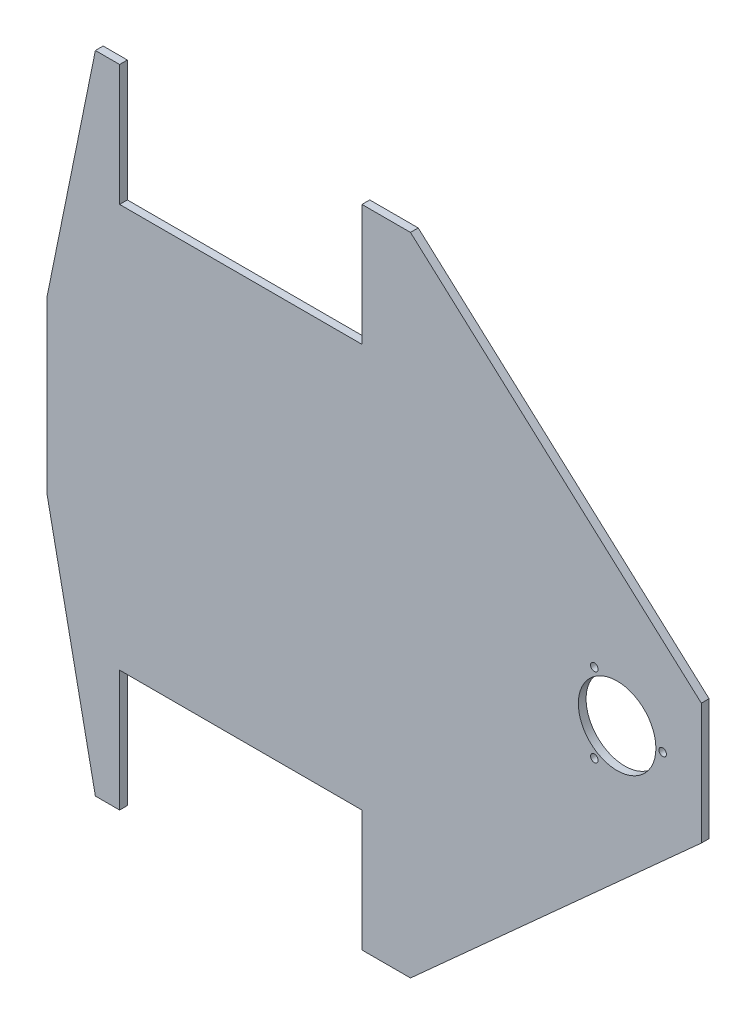
ISO-10303-21;
HEADER;
FILE_DESCRIPTION(('STEP AP214'),'2;1');
FILE_NAME('part.step','',(''),(''),'','','');
FILE_SCHEMA(('AUTOMOTIVE_DESIGN { 1 0 10303 214 1 1 1 1 }'));
ENDSEC;
DATA;
#1=APPLICATION_CONTEXT('core data for automotive mechanical design processes');
#2=APPLICATION_PROTOCOL_DEFINITION('international standard','automotive_design',2000,#1);
#3=PRODUCT_CONTEXT('',#1,'mechanical');
#4=PRODUCT('Part','Part','',(#3));
#5=PRODUCT_RELATED_PRODUCT_CATEGORY('part','',(#4));
#6=PRODUCT_DEFINITION_FORMATION('','',#4);
#7=PRODUCT_DEFINITION_CONTEXT('part definition',#1,'design');
#8=PRODUCT_DEFINITION('design','',#6,#7);
#9=PRODUCT_DEFINITION_SHAPE('','',#8);
#10=(LENGTH_UNIT() NAMED_UNIT(*) SI_UNIT(.MILLI.,.METRE.));
#11=(NAMED_UNIT(*) PLANE_ANGLE_UNIT() SI_UNIT($,.RADIAN.));
#12=(NAMED_UNIT(*) SI_UNIT($,.STERADIAN.) SOLID_ANGLE_UNIT());
#13=UNCERTAINTY_MEASURE_WITH_UNIT(LENGTH_MEASURE(1.E-05),#10,'distance_accuracy_value','');
#14=(GEOMETRIC_REPRESENTATION_CONTEXT(3) GLOBAL_UNCERTAINTY_ASSIGNED_CONTEXT((#13)) GLOBAL_UNIT_ASSIGNED_CONTEXT((#10,
#11,#12)) REPRESENTATION_CONTEXT('',''));
#15=CARTESIAN_POINT('',(0.,0.,0.));
#16=DIRECTION('',(0.,0.,1.));
#17=DIRECTION('',(1.,0.,0.));
#18=AXIS2_PLACEMENT_3D('',#15,#16,#17);
#19=CARTESIAN_POINT('',(0.,0.,0.));
#20=DIRECTION('',(0.,0.,1.));
#21=DIRECTION('',(1.,0.,0.));
#22=AXIS2_PLACEMENT_3D('',#19,#20,#21);
#23=PLANE('',#22);
#24=CARTESIAN_POINT('',(145.85,95.8088150912347,0.));
#25=DIRECTION('',(0.,0.,-1.));
#26=DIRECTION('',(-1.,0.,0.));
#27=AXIS2_PLACEMENT_3D('',#24,#25,#26);
#28=CIRCLE('',#27,1.55);
#29=CARTESIAN_POINT('',(144.3,95.8088150912347,0.));
#30=VERTEX_POINT('',#29);
#31=EDGE_CURVE('E301',#30,#30,#28,.T.);
#32=ORIENTED_EDGE('',*,*,#31,.F.);
#33=EDGE_LOOP('',(#32));
#34=FACE_BOUND('',#33,.T.);
#35=CARTESIAN_POINT('',(145.85,63.2462599089398,0.));
#36=DIRECTION('',(0.,0.,-1.));
#37=DIRECTION('',(-1.,0.,0.));
#38=AXIS2_PLACEMENT_3D('',#35,#36,#37);
#39=CIRCLE('',#38,1.55);
#40=CARTESIAN_POINT('',(144.3,63.2462599089398,0.));
#41=VERTEX_POINT('',#40);
#42=EDGE_CURVE('E303',#41,#41,#39,.T.);
#43=ORIENTED_EDGE('',*,*,#42,.F.);
#44=EDGE_LOOP('',(#43));
#45=FACE_BOUND('',#44,.T.);
#46=CARTESIAN_POINT('',(155.25,79.5275375000873,0.));
#47=DIRECTION('',(0.,0.,1.));
#48=DIRECTION('',(1.,0.,0.));
#49=AXIS2_PLACEMENT_3D('',#46,#47,#48);
#50=CIRCLE('',#49,16.);
#51=CARTESIAN_POINT('',(171.25,79.5275375000873,0.));
#52=VERTEX_POINT('',#51);
#53=EDGE_CURVE('E43',#52,#52,#50,.T.);
#54=ORIENTED_EDGE('',*,*,#53,.T.);
#55=EDGE_LOOP('',(#54));
#56=FACE_BOUND('',#55,.T.);
#57=DIRECTION('',(0.,1.,0.));
#58=VECTOR('',#57,1.);
#59=CARTESIAN_POINT('',(-80.,45.,0.));
#60=LINE('',#59,#58);
#61=CARTESIAN_POINT('',(-80.,45.,0.));
#62=VERTEX_POINT('',#61);
#63=CARTESIAN_POINT('',(-80.,115.,0.));
#64=VERTEX_POINT('',#63);
#65=EDGE_CURVE('E186',#62,#64,#60,.T.);
#66=ORIENTED_EDGE('',*,*,#65,.T.);
#67=DIRECTION('',(0.199568997239386,0.979883776445383,0.));
#68=VECTOR('',#67,1.);
#69=CARTESIAN_POINT('',(-80.,115.,0.));
#70=LINE('',#69,#68);
#71=CARTESIAN_POINT('',(-60.,213.2,0.));
#72=VERTEX_POINT('',#71);
#73=EDGE_CURVE('E189',#64,#72,#70,.T.);
#74=ORIENTED_EDGE('',*,*,#73,.T.);
#75=DIRECTION('',(-1.,0.,0.));
#76=VECTOR('',#75,1.);
#77=CARTESIAN_POINT('',(-50.,213.2,0.));
#78=LINE('',#77,#76);
#79=CARTESIAN_POINT('',(-50.,213.2,0.));
#80=VERTEX_POINT('',#79);
#81=EDGE_CURVE('E192',#80,#72,#78,.T.);
#82=ORIENTED_EDGE('',*,*,#81,.F.);
#83=DIRECTION('',(0.,1.,0.));
#84=VECTOR('',#83,1.);
#85=CARTESIAN_POINT('',(-50.,163.2,0.));
#86=LINE('',#85,#84);
#87=CARTESIAN_POINT('',(-50.,163.2,0.));
#88=VERTEX_POINT('',#87);
#89=EDGE_CURVE('E195',#88,#80,#86,.T.);
#90=ORIENTED_EDGE('',*,*,#89,.F.);
#91=DIRECTION('',(-1.,0.,0.));
#92=VECTOR('',#91,1.);
#93=CARTESIAN_POINT('',(50.,163.2,0.));
#94=LINE('',#93,#92);
#95=CARTESIAN_POINT('',(50.,163.2,0.));
#96=VERTEX_POINT('',#95);
#97=EDGE_CURVE('E197',#96,#88,#94,.T.);
#98=ORIENTED_EDGE('',*,*,#97,.F.);
#99=DIRECTION('',(0.,1.,0.));
#100=VECTOR('',#99,1.);
#101=CARTESIAN_POINT('',(50.,163.2,0.));
#102=LINE('',#101,#100);
#103=CARTESIAN_POINT('',(50.,213.2,0.));
#104=VERTEX_POINT('',#103);
#105=EDGE_CURVE('E199',#96,#104,#102,.T.);
#106=ORIENTED_EDGE('',*,*,#105,.T.);
#107=DIRECTION('',(1.,0.,0.));
#108=VECTOR('',#107,1.);
#109=CARTESIAN_POINT('',(50.,213.2,0.));
#110=LINE('',#109,#108);
#111=CARTESIAN_POINT('',(70.,213.2,0.));
#112=VERTEX_POINT('',#111);
#113=EDGE_CURVE('E202',#104,#112,#110,.T.);
#114=ORIENTED_EDGE('',*,*,#113,.T.);
#115=DIRECTION('',(0.742678352355033,-0.669648314373458,0.));
#116=VECTOR('',#115,1.);
#117=CARTESIAN_POINT('',(70.,213.2,0.));
#118=LINE('',#117,#116);
#119=CARTESIAN_POINT('',(190.000000000002,104.999999999998,0.));
#120=VERTEX_POINT('',#119);
#121=EDGE_CURVE('E205',#112,#120,#118,.T.);
#122=ORIENTED_EDGE('',*,*,#121,.T.);
#123=DIRECTION('',(0.,-1.,0.));
#124=VECTOR('',#123,1.);
#125=CARTESIAN_POINT('',(190.000000000002,104.999999999998,0.));
#126=LINE('',#125,#124);
#127=CARTESIAN_POINT('',(190.000000000001,54.9999999999979,0.));
#128=VERTEX_POINT('',#127);
#129=EDGE_CURVE('E208',#120,#128,#126,.T.);
#130=ORIENTED_EDGE('',*,*,#129,.T.);
#131=DIRECTION('',(-0.742678352355045,-0.669648314373445,0.));
#132=VECTOR('',#131,1.);
#133=CARTESIAN_POINT('',(190.000000000001,54.9999999999979,0.));
#134=LINE('',#133,#132);
#135=CARTESIAN_POINT('',(70.,-53.2,0.));
#136=VERTEX_POINT('',#135);
#137=EDGE_CURVE('E211',#128,#136,#134,.T.);
#138=ORIENTED_EDGE('',*,*,#137,.T.);
#139=DIRECTION('',(1.,0.,0.));
#140=VECTOR('',#139,1.);
#141=CARTESIAN_POINT('',(50.,-53.2,0.));
#142=LINE('',#141,#140);
#143=CARTESIAN_POINT('',(50.,-53.2,0.));
#144=VERTEX_POINT('',#143);
#145=EDGE_CURVE('E214',#144,#136,#142,.T.);
#146=ORIENTED_EDGE('',*,*,#145,.F.);
#147=DIRECTION('',(0.,-1.,0.));
#148=VECTOR('',#147,1.);
#149=CARTESIAN_POINT('',(50.,-3.2,0.));
#150=LINE('',#149,#148);
#151=CARTESIAN_POINT('',(50.,-3.2,0.));
#152=VERTEX_POINT('',#151);
#153=EDGE_CURVE('E217',#152,#144,#150,.T.);
#154=ORIENTED_EDGE('',*,*,#153,.F.);
#155=DIRECTION('',(-1.,0.,0.));
#156=VECTOR('',#155,1.);
#157=CARTESIAN_POINT('',(50.,-3.2,0.));
#158=LINE('',#157,#156);
#159=CARTESIAN_POINT('',(-50.,-3.2,0.));
#160=VERTEX_POINT('',#159);
#161=EDGE_CURVE('E219',#152,#160,#158,.T.);
#162=ORIENTED_EDGE('',*,*,#161,.T.);
#163=DIRECTION('',(0.,-1.,0.));
#164=VECTOR('',#163,1.);
#165=CARTESIAN_POINT('',(-50.,-3.2,0.));
#166=LINE('',#165,#164);
#167=CARTESIAN_POINT('',(-50.,-53.2,0.));
#168=VERTEX_POINT('',#167);
#169=EDGE_CURVE('E222',#160,#168,#166,.T.);
#170=ORIENTED_EDGE('',*,*,#169,.T.);
#171=DIRECTION('',(-1.,0.,0.));
#172=VECTOR('',#171,1.);
#173=CARTESIAN_POINT('',(-50.,-53.2,0.));
#174=LINE('',#173,#172);
#175=CARTESIAN_POINT('',(-60.,-53.2,0.));
#176=VERTEX_POINT('',#175);
#177=EDGE_CURVE('E163',#168,#176,#174,.T.);
#178=ORIENTED_EDGE('',*,*,#177,.T.);
#179=DIRECTION('',(-0.199568997239386,0.979883776445383,0.));
#180=VECTOR('',#179,1.);
#181=CARTESIAN_POINT('',(-60.,-53.2,0.));
#182=LINE('',#181,#180);
#183=EDGE_CURVE('E225',#176,#62,#182,.T.);
#184=ORIENTED_EDGE('',*,*,#183,.T.);
#185=EDGE_LOOP('',(#66,#74,#82,#90,#98,#106,#114,#122,#130,#138,#146,#154,#162,#170,#178,#184));
#186=FACE_BOUND('',#185,.T.);
#187=CARTESIAN_POINT('',(174.05,79.5275375000871,0.));
#188=DIRECTION('',(0.,0.,-1.));
#189=DIRECTION('',(-1.,0.,0.));
#190=AXIS2_PLACEMENT_3D('',#187,#188,#189);
#191=CIRCLE('',#190,1.55);
#192=CARTESIAN_POINT('',(172.5,79.5275375000871,0.));
#193=VERTEX_POINT('',#192);
#194=EDGE_CURVE('E311',#193,#193,#191,.T.);
#195=ORIENTED_EDGE('',*,*,#194,.F.);
#196=EDGE_LOOP('',(#195));
#197=FACE_BOUND('',#196,.T.);
#198=ADVANCED_FACE('F39',(#34,#45,#56,#186,#197),#23,.F.);
#199=CARTESIAN_POINT('',(-80.,45.,3.2));
#200=DIRECTION('',(-1.,0.,0.));
#201=DIRECTION('',(0.,0.,1.));
#202=AXIS2_PLACEMENT_3D('',#199,#200,#201);
#203=PLANE('',#202);
#204=ORIENTED_EDGE('',*,*,#65,.F.);
#205=DIRECTION('',(0.,0.,-1.));
#206=VECTOR('',#205,1.);
#207=CARTESIAN_POINT('',(-80.,45.,3.2));
#208=LINE('',#207,#206);
#209=CARTESIAN_POINT('',(-80.,45.,3.2));
#210=VERTEX_POINT('',#209);
#211=EDGE_CURVE('E11',#210,#62,#208,.T.);
#212=ORIENTED_EDGE('',*,*,#211,.F.);
#213=DIRECTION('',(0.,1.,0.));
#214=VECTOR('',#213,1.);
#215=CARTESIAN_POINT('',(-80.,45.,3.2));
#216=LINE('',#215,#214);
#217=CARTESIAN_POINT('',(-80.,115.,3.2));
#218=VERTEX_POINT('',#217);
#219=EDGE_CURVE('E227',#210,#218,#216,.T.);
#220=ORIENTED_EDGE('',*,*,#219,.T.);
#221=DIRECTION('',(0.,0.,-1.));
#222=VECTOR('',#221,1.);
#223=CARTESIAN_POINT('',(-80.,115.,3.2));
#224=LINE('',#223,#222);
#225=EDGE_CURVE('E120',#218,#64,#224,.T.);
#226=ORIENTED_EDGE('',*,*,#225,.T.);
#227=EDGE_LOOP('',(#204,#212,#220,#226));
#228=FACE_BOUND('',#227,.T.);
#229=ADVANCED_FACE('F41',(#228),#203,.T.);
#230=CARTESIAN_POINT('',(-60.,-53.2,3.2));
#231=DIRECTION('',(-0.979883776445383,-0.199568997239386,0.));
#232=DIRECTION('',(0.199568997239386,-0.979883776445383,0.));
#233=AXIS2_PLACEMENT_3D('',#230,#231,#232);
#234=PLANE('',#233);
#235=ORIENTED_EDGE('',*,*,#183,.F.);
#236=DIRECTION('',(0.,0.,-1.));
#237=VECTOR('',#236,1.);
#238=CARTESIAN_POINT('',(-60.,-53.2,3.2));
#239=LINE('',#238,#237);
#240=CARTESIAN_POINT('',(-60.,-53.2,3.2));
#241=VERTEX_POINT('',#240);
#242=EDGE_CURVE('E49',#241,#176,#239,.T.);
#243=ORIENTED_EDGE('',*,*,#242,.F.);
#244=DIRECTION('',(-0.199568997239386,0.979883776445383,0.));
#245=VECTOR('',#244,1.);
#246=CARTESIAN_POINT('',(-60.,-53.2,3.2));
#247=LINE('',#246,#245);
#248=EDGE_CURVE('E176',#241,#210,#247,.T.);
#249=ORIENTED_EDGE('',*,*,#248,.T.);
#250=ORIENTED_EDGE('',*,*,#211,.T.);
#251=EDGE_LOOP('',(#235,#243,#249,#250));
#252=FACE_BOUND('',#251,.T.);
#253=ADVANCED_FACE('F260',(#252),#234,.T.);
#254=CARTESIAN_POINT('',(-50.,-53.2,3.2));
#255=DIRECTION('',(0.,-1.,0.));
#256=DIRECTION('',(0.,0.,-1.));
#257=AXIS2_PLACEMENT_3D('',#254,#255,#256);
#258=PLANE('',#257);
#259=ORIENTED_EDGE('',*,*,#177,.F.);
#260=DIRECTION('',(0.,0.,-1.));
#261=VECTOR('',#260,1.);
#262=CARTESIAN_POINT('',(-50.,-53.2,3.2));
#263=LINE('',#262,#261);
#264=CARTESIAN_POINT('',(-50.,-53.2,3.2));
#265=VERTEX_POINT('',#264);
#266=EDGE_CURVE('E158',#265,#168,#263,.T.);
#267=ORIENTED_EDGE('',*,*,#266,.F.);
#268=DIRECTION('',(-1.,0.,0.));
#269=VECTOR('',#268,1.);
#270=CARTESIAN_POINT('',(-50.,-53.2,3.2));
#271=LINE('',#270,#269);
#272=EDGE_CURVE('E161',#265,#241,#271,.T.);
#273=ORIENTED_EDGE('',*,*,#272,.T.);
#274=ORIENTED_EDGE('',*,*,#242,.T.);
#275=EDGE_LOOP('',(#259,#267,#273,#274));
#276=FACE_BOUND('',#275,.T.);
#277=ADVANCED_FACE('F160',(#276),#258,.T.);
#278=CARTESIAN_POINT('',(-50.,-3.2,3.2));
#279=DIRECTION('',(1.,0.,0.));
#280=DIRECTION('',(0.,0.,-1.));
#281=AXIS2_PLACEMENT_3D('',#278,#279,#280);
#282=PLANE('',#281);
#283=ORIENTED_EDGE('',*,*,#169,.F.);
#284=DIRECTION('',(0.,0.,-1.));
#285=VECTOR('',#284,1.);
#286=CARTESIAN_POINT('',(-50.,-3.2,3.2));
#287=LINE('',#286,#285);
#288=CARTESIAN_POINT('',(-50.,-3.2,3.2));
#289=VERTEX_POINT('',#288);
#290=EDGE_CURVE('E168',#289,#160,#287,.T.);
#291=ORIENTED_EDGE('',*,*,#290,.F.);
#292=DIRECTION('',(0.,-1.,0.));
#293=VECTOR('',#292,1.);
#294=CARTESIAN_POINT('',(-50.,-3.2,3.2));
#295=LINE('',#294,#293);
#296=EDGE_CURVE('E174',#289,#265,#295,.T.);
#297=ORIENTED_EDGE('',*,*,#296,.T.);
#298=ORIENTED_EDGE('',*,*,#266,.T.);
#299=EDGE_LOOP('',(#283,#291,#297,#298));
#300=FACE_BOUND('',#299,.T.);
#301=ADVANCED_FACE('F178',(#300),#282,.T.);
#302=CARTESIAN_POINT('',(50.,-3.2,3.2));
#303=DIRECTION('',(0.,-1.,0.));
#304=DIRECTION('',(0.,0.,-1.));
#305=AXIS2_PLACEMENT_3D('',#302,#303,#304);
#306=PLANE('',#305);
#307=ORIENTED_EDGE('',*,*,#161,.F.);
#308=DIRECTION('',(0.,0.,-1.));
#309=VECTOR('',#308,1.);
#310=CARTESIAN_POINT('',(50.,-3.2,3.2));
#311=LINE('',#310,#309);
#312=CARTESIAN_POINT('',(50.,-3.2,3.2));
#313=VERTEX_POINT('',#312);
#314=EDGE_CURVE('E231',#313,#152,#311,.T.);
#315=ORIENTED_EDGE('',*,*,#314,.F.);
#316=DIRECTION('',(-1.,0.,0.));
#317=VECTOR('',#316,1.);
#318=CARTESIAN_POINT('',(50.,-3.2,3.2));
#319=LINE('',#318,#317);
#320=EDGE_CURVE('E179',#313,#289,#319,.T.);
#321=ORIENTED_EDGE('',*,*,#320,.T.);
#322=ORIENTED_EDGE('',*,*,#290,.T.);
#323=EDGE_LOOP('',(#307,#315,#321,#322));
#324=FACE_BOUND('',#323,.T.);
#325=ADVANCED_FACE('F390',(#324),#306,.T.);
#326=CARTESIAN_POINT('',(50.,-3.2,3.2));
#327=DIRECTION('',(1.,0.,0.));
#328=DIRECTION('',(0.,0.,-1.));
#329=AXIS2_PLACEMENT_3D('',#326,#327,#328);
#330=PLANE('',#329);
#331=ORIENTED_EDGE('',*,*,#153,.T.);
#332=DIRECTION('',(0.,0.,-1.));
#333=VECTOR('',#332,1.);
#334=CARTESIAN_POINT('',(50.,-53.2,3.2));
#335=LINE('',#334,#333);
#336=CARTESIAN_POINT('',(50.,-53.2,3.2));
#337=VERTEX_POINT('',#336);
#338=EDGE_CURVE('E233',#337,#144,#335,.T.);
#339=ORIENTED_EDGE('',*,*,#338,.F.);
#340=DIRECTION('',(0.,-1.,0.));
#341=VECTOR('',#340,1.);
#342=CARTESIAN_POINT('',(50.,-3.2,3.2));
#343=LINE('',#342,#341);
#344=EDGE_CURVE('E181',#313,#337,#343,.T.);
#345=ORIENTED_EDGE('',*,*,#344,.F.);
#346=ORIENTED_EDGE('',*,*,#314,.T.);
#347=EDGE_LOOP('',(#331,#339,#345,#346));
#348=FACE_BOUND('',#347,.T.);
#349=ADVANCED_FACE('F351',(#348),#330,.F.);
#350=CARTESIAN_POINT('',(50.,-53.2,3.2));
#351=DIRECTION('',(0.,1.,0.));
#352=DIRECTION('',(0.,0.,1.));
#353=AXIS2_PLACEMENT_3D('',#350,#351,#352);
#354=PLANE('',#353);
#355=ORIENTED_EDGE('',*,*,#145,.T.);
#356=DIRECTION('',(0.,0.,-1.));
#357=VECTOR('',#356,1.);
#358=CARTESIAN_POINT('',(70.,-53.2,3.2));
#359=LINE('',#358,#357);
#360=CARTESIAN_POINT('',(70.,-53.2,3.2));
#361=VERTEX_POINT('',#360);
#362=EDGE_CURVE('E236',#361,#136,#359,.T.);
#363=ORIENTED_EDGE('',*,*,#362,.F.);
#364=DIRECTION('',(1.,0.,0.));
#365=VECTOR('',#364,1.);
#366=CARTESIAN_POINT('',(50.,-53.2,3.2));
#367=LINE('',#366,#365);
#368=EDGE_CURVE('E344',#337,#361,#367,.T.);
#369=ORIENTED_EDGE('',*,*,#368,.F.);
#370=ORIENTED_EDGE('',*,*,#338,.T.);
#371=EDGE_LOOP('',(#355,#363,#369,#370));
#372=FACE_BOUND('',#371,.T.);
#373=ADVANCED_FACE('F355',(#372),#354,.F.);
#374=CARTESIAN_POINT('',(190.000000000001,54.9999999999979,3.2));
#375=DIRECTION('',(0.669648314373445,-0.742678352355045,0.));
#376=DIRECTION('',(0.742678352355045,0.669648314373445,0.));
#377=AXIS2_PLACEMENT_3D('',#374,#375,#376);
#378=PLANE('',#377);
#379=ORIENTED_EDGE('',*,*,#137,.F.);
#380=DIRECTION('',(0.,0.,-1.));
#381=VECTOR('',#380,1.);
#382=CARTESIAN_POINT('',(190.000000000001,54.9999999999979,3.2));
#383=LINE('',#382,#381);
#384=CARTESIAN_POINT('',(190.000000000001,54.9999999999979,3.2));
#385=VERTEX_POINT('',#384);
#386=EDGE_CURVE('E238',#385,#128,#383,.T.);
#387=ORIENTED_EDGE('',*,*,#386,.F.);
#388=DIRECTION('',(-0.742678352355045,-0.669648314373445,0.));
#389=VECTOR('',#388,1.);
#390=CARTESIAN_POINT('',(190.000000000001,54.9999999999979,3.2));
#391=LINE('',#390,#389);
#392=EDGE_CURVE('E341',#385,#361,#391,.T.);
#393=ORIENTED_EDGE('',*,*,#392,.T.);
#394=ORIENTED_EDGE('',*,*,#362,.T.);
#395=EDGE_LOOP('',(#379,#387,#393,#394));
#396=FACE_BOUND('',#395,.T.);
#397=ADVANCED_FACE('F358',(#396),#378,.T.);
#398=CARTESIAN_POINT('',(190.000000000002,104.999999999998,3.2));
#399=DIRECTION('',(1.,0.,0.));
#400=DIRECTION('',(0.,1.,0.));
#401=AXIS2_PLACEMENT_3D('',#398,#399,#400);
#402=PLANE('',#401);
#403=ORIENTED_EDGE('',*,*,#129,.F.);
#404=DIRECTION('',(0.,0.,-1.));
#405=VECTOR('',#404,1.);
#406=CARTESIAN_POINT('',(190.000000000002,104.999999999998,3.2));
#407=LINE('',#406,#405);
#408=CARTESIAN_POINT('',(190.000000000002,104.999999999998,3.2));
#409=VERTEX_POINT('',#408);
#410=EDGE_CURVE('E240',#409,#120,#407,.T.);
#411=ORIENTED_EDGE('',*,*,#410,.F.);
#412=DIRECTION('',(0.,-1.,0.));
#413=VECTOR('',#412,1.);
#414=CARTESIAN_POINT('',(190.000000000002,104.999999999998,3.2));
#415=LINE('',#414,#413);
#416=EDGE_CURVE('E338',#409,#385,#415,.T.);
#417=ORIENTED_EDGE('',*,*,#416,.T.);
#418=ORIENTED_EDGE('',*,*,#386,.T.);
#419=EDGE_LOOP('',(#403,#411,#417,#418));
#420=FACE_BOUND('',#419,.T.);
#421=ADVANCED_FACE('F363',(#420),#402,.T.);
#422=CARTESIAN_POINT('',(70.,213.2,3.2));
#423=DIRECTION('',(0.669648314373458,0.742678352355033,0.));
#424=DIRECTION('',(-0.742678352355033,0.669648314373458,0.));
#425=AXIS2_PLACEMENT_3D('',#422,#423,#424);
#426=PLANE('',#425);
#427=ORIENTED_EDGE('',*,*,#121,.F.);
#428=DIRECTION('',(0.,0.,-1.));
#429=VECTOR('',#428,1.);
#430=CARTESIAN_POINT('',(70.,213.2,3.2));
#431=LINE('',#430,#429);
#432=CARTESIAN_POINT('',(70.,213.2,3.2));
#433=VERTEX_POINT('',#432);
#434=EDGE_CURVE('E242',#433,#112,#431,.T.);
#435=ORIENTED_EDGE('',*,*,#434,.F.);
#436=DIRECTION('',(0.742678352355033,-0.669648314373458,0.));
#437=VECTOR('',#436,1.);
#438=CARTESIAN_POINT('',(70.,213.2,3.2));
#439=LINE('',#438,#437);
#440=EDGE_CURVE('E335',#433,#409,#439,.T.);
#441=ORIENTED_EDGE('',*,*,#440,.T.);
#442=ORIENTED_EDGE('',*,*,#410,.T.);
#443=EDGE_LOOP('',(#427,#435,#441,#442));
#444=FACE_BOUND('',#443,.T.);
#445=ADVANCED_FACE('F366',(#444),#426,.T.);
#446=CARTESIAN_POINT('',(50.,213.2,3.2));
#447=DIRECTION('',(0.,1.,0.));
#448=DIRECTION('',(0.,0.,1.));
#449=AXIS2_PLACEMENT_3D('',#446,#447,#448);
#450=PLANE('',#449);
#451=ORIENTED_EDGE('',*,*,#113,.F.);
#452=DIRECTION('',(0.,0.,-1.));
#453=VECTOR('',#452,1.);
#454=CARTESIAN_POINT('',(50.,213.2,3.2));
#455=LINE('',#454,#453);
#456=CARTESIAN_POINT('',(50.,213.2,3.2));
#457=VERTEX_POINT('',#456);
#458=EDGE_CURVE('E244',#457,#104,#455,.T.);
#459=ORIENTED_EDGE('',*,*,#458,.F.);
#460=DIRECTION('',(1.,0.,0.));
#461=VECTOR('',#460,1.);
#462=CARTESIAN_POINT('',(50.,213.2,3.2));
#463=LINE('',#462,#461);
#464=EDGE_CURVE('E332',#457,#433,#463,.T.);
#465=ORIENTED_EDGE('',*,*,#464,.T.);
#466=ORIENTED_EDGE('',*,*,#434,.T.);
#467=EDGE_LOOP('',(#451,#459,#465,#466));
#468=FACE_BOUND('',#467,.T.);
#469=ADVANCED_FACE('F371',(#468),#450,.T.);
#470=CARTESIAN_POINT('',(50.,163.2,3.2));
#471=DIRECTION('',(-1.,0.,0.));
#472=DIRECTION('',(0.,-1.,0.));
#473=AXIS2_PLACEMENT_3D('',#470,#471,#472);
#474=PLANE('',#473);
#475=ORIENTED_EDGE('',*,*,#105,.F.);
#476=DIRECTION('',(0.,0.,-1.));
#477=VECTOR('',#476,1.);
#478=CARTESIAN_POINT('',(50.,163.2,3.2));
#479=LINE('',#478,#477);
#480=CARTESIAN_POINT('',(50.,163.2,3.2));
#481=VERTEX_POINT('',#480);
#482=EDGE_CURVE('E246',#481,#96,#479,.T.);
#483=ORIENTED_EDGE('',*,*,#482,.F.);
#484=DIRECTION('',(0.,1.,0.));
#485=VECTOR('',#484,1.);
#486=CARTESIAN_POINT('',(50.,163.2,3.2));
#487=LINE('',#486,#485);
#488=EDGE_CURVE('E329',#481,#457,#487,.T.);
#489=ORIENTED_EDGE('',*,*,#488,.T.);
#490=ORIENTED_EDGE('',*,*,#458,.T.);
#491=EDGE_LOOP('',(#475,#483,#489,#490));
#492=FACE_BOUND('',#491,.T.);
#493=ADVANCED_FACE('F374',(#492),#474,.T.);
#494=CARTESIAN_POINT('',(50.,163.2,3.2));
#495=DIRECTION('',(0.,-1.,0.));
#496=DIRECTION('',(1.,0.,0.));
#497=AXIS2_PLACEMENT_3D('',#494,#495,#496);
#498=PLANE('',#497);
#499=ORIENTED_EDGE('',*,*,#97,.T.);
#500=DIRECTION('',(0.,0.,-1.));
#501=VECTOR('',#500,1.);
#502=CARTESIAN_POINT('',(-50.,163.2,3.2));
#503=LINE('',#502,#501);
#504=CARTESIAN_POINT('',(-50.,163.2,3.2));
#505=VERTEX_POINT('',#504);
#506=EDGE_CURVE('E248',#505,#88,#503,.T.);
#507=ORIENTED_EDGE('',*,*,#506,.F.);
#508=DIRECTION('',(-1.,0.,0.));
#509=VECTOR('',#508,1.);
#510=CARTESIAN_POINT('',(50.,163.2,3.2));
#511=LINE('',#510,#509);
#512=EDGE_CURVE('E327',#481,#505,#511,.T.);
#513=ORIENTED_EDGE('',*,*,#512,.F.);
#514=ORIENTED_EDGE('',*,*,#482,.T.);
#515=EDGE_LOOP('',(#499,#507,#513,#514));
#516=FACE_BOUND('',#515,.T.);
#517=ADVANCED_FACE('F380',(#516),#498,.F.);
#518=CARTESIAN_POINT('',(-50.,163.2,3.2));
#519=DIRECTION('',(-1.,0.,0.));
#520=DIRECTION('',(0.,-1.,0.));
#521=AXIS2_PLACEMENT_3D('',#518,#519,#520);
#522=PLANE('',#521);
#523=ORIENTED_EDGE('',*,*,#89,.T.);
#524=DIRECTION('',(0.,0.,-1.));
#525=VECTOR('',#524,1.);
#526=CARTESIAN_POINT('',(-50.,213.2,3.2));
#527=LINE('',#526,#525);
#528=CARTESIAN_POINT('',(-50.,213.2,3.2));
#529=VERTEX_POINT('',#528);
#530=EDGE_CURVE('E251',#529,#80,#527,.T.);
#531=ORIENTED_EDGE('',*,*,#530,.F.);
#532=DIRECTION('',(0.,1.,0.));
#533=VECTOR('',#532,1.);
#534=CARTESIAN_POINT('',(-50.,163.2,3.2));
#535=LINE('',#534,#533);
#536=EDGE_CURVE('E325',#505,#529,#535,.T.);
#537=ORIENTED_EDGE('',*,*,#536,.F.);
#538=ORIENTED_EDGE('',*,*,#506,.T.);
#539=EDGE_LOOP('',(#523,#531,#537,#538));
#540=FACE_BOUND('',#539,.T.);
#541=ADVANCED_FACE('F384',(#540),#522,.F.);
#542=CARTESIAN_POINT('',(-50.,213.2,3.2));
#543=DIRECTION('',(0.,-1.,0.));
#544=DIRECTION('',(0.,0.,-1.));
#545=AXIS2_PLACEMENT_3D('',#542,#543,#544);
#546=PLANE('',#545);
#547=ORIENTED_EDGE('',*,*,#81,.T.);
#548=DIRECTION('',(0.,0.,-1.));
#549=VECTOR('',#548,1.);
#550=CARTESIAN_POINT('',(-60.,213.2,3.2));
#551=LINE('',#550,#549);
#552=CARTESIAN_POINT('',(-60.,213.2,3.2));
#553=VERTEX_POINT('',#552);
#554=EDGE_CURVE('E254',#553,#72,#551,.T.);
#555=ORIENTED_EDGE('',*,*,#554,.F.);
#556=DIRECTION('',(-1.,0.,0.));
#557=VECTOR('',#556,1.);
#558=CARTESIAN_POINT('',(-50.,213.2,3.2));
#559=LINE('',#558,#557);
#560=EDGE_CURVE('E323',#529,#553,#559,.T.);
#561=ORIENTED_EDGE('',*,*,#560,.F.);
#562=ORIENTED_EDGE('',*,*,#530,.T.);
#563=EDGE_LOOP('',(#547,#555,#561,#562));
#564=FACE_BOUND('',#563,.T.);
#565=ADVANCED_FACE('F387',(#564),#546,.F.);
#566=CARTESIAN_POINT('',(-80.,115.,3.2));
#567=DIRECTION('',(-0.979883776445383,0.199568997239386,0.));
#568=DIRECTION('',(-0.199568997239386,-0.979883776445383,0.));
#569=AXIS2_PLACEMENT_3D('',#566,#567,#568);
#570=PLANE('',#569);
#571=ORIENTED_EDGE('',*,*,#73,.F.);
#572=ORIENTED_EDGE('',*,*,#225,.F.);
#573=DIRECTION('',(0.199568997239386,0.979883776445383,0.));
#574=VECTOR('',#573,1.);
#575=CARTESIAN_POINT('',(-80.,115.,3.2));
#576=LINE('',#575,#574);
#577=EDGE_CURVE('E321',#218,#553,#576,.T.);
#578=ORIENTED_EDGE('',*,*,#577,.T.);
#579=ORIENTED_EDGE('',*,*,#554,.T.);
#580=EDGE_LOOP('',(#571,#572,#578,#579));
#581=FACE_BOUND('',#580,.T.);
#582=ADVANCED_FACE('F255',(#581),#570,.T.);
#583=CARTESIAN_POINT('',(0.,0.,3.2));
#584=DIRECTION('',(0.,0.,1.));
#585=DIRECTION('',(1.,0.,0.));
#586=AXIS2_PLACEMENT_3D('',#583,#584,#585);
#587=PLANE('',#586);
#588=CARTESIAN_POINT('',(145.85,95.8088150912347,3.2));
#589=DIRECTION('',(0.,0.,-1.));
#590=DIRECTION('',(-1.,0.,0.));
#591=AXIS2_PLACEMENT_3D('',#588,#589,#590);
#592=CIRCLE('',#591,1.55);
#593=CARTESIAN_POINT('',(144.3,95.8088150912347,3.2));
#594=VERTEX_POINT('',#593);
#595=EDGE_CURVE('E299',#594,#594,#592,.T.);
#596=ORIENTED_EDGE('',*,*,#595,.T.);
#597=EDGE_LOOP('',(#596));
#598=FACE_BOUND('',#597,.T.);
#599=CARTESIAN_POINT('',(145.85,63.2462599089398,3.2));
#600=DIRECTION('',(0.,0.,-1.));
#601=DIRECTION('',(-1.,0.,0.));
#602=AXIS2_PLACEMENT_3D('',#599,#600,#601);
#603=CIRCLE('',#602,1.55);
#604=CARTESIAN_POINT('',(144.3,63.2462599089398,3.2));
#605=VERTEX_POINT('',#604);
#606=EDGE_CURVE('E308',#605,#605,#603,.T.);
#607=ORIENTED_EDGE('',*,*,#606,.T.);
#608=EDGE_LOOP('',(#607));
#609=FACE_BOUND('',#608,.T.);
#610=CARTESIAN_POINT('',(174.05,79.5275375000871,3.2));
#611=DIRECTION('',(0.,0.,-1.));
#612=DIRECTION('',(-1.,0.,0.));
#613=AXIS2_PLACEMENT_3D('',#610,#611,#612);
#614=CIRCLE('',#613,1.55);
#615=CARTESIAN_POINT('',(172.5,79.5275375000871,3.2));
#616=VERTEX_POINT('',#615);
#617=EDGE_CURVE('E314',#616,#616,#614,.T.);
#618=ORIENTED_EDGE('',*,*,#617,.T.);
#619=EDGE_LOOP('',(#618));
#620=FACE_BOUND('',#619,.T.);
#621=CARTESIAN_POINT('',(155.25,79.5275375000873,3.2));
#622=DIRECTION('',(0.,0.,1.));
#623=DIRECTION('',(1.,0.,0.));
#624=AXIS2_PLACEMENT_3D('',#621,#622,#623);
#625=CIRCLE('',#624,16.);
#626=CARTESIAN_POINT('',(171.25,79.5275375000873,3.2));
#627=VERTEX_POINT('',#626);
#628=EDGE_CURVE('E317',#627,#627,#625,.T.);
#629=ORIENTED_EDGE('',*,*,#628,.F.);
#630=EDGE_LOOP('',(#629));
#631=FACE_BOUND('',#630,.T.);
#632=ORIENTED_EDGE('',*,*,#219,.F.);
#633=ORIENTED_EDGE('',*,*,#248,.F.);
#634=ORIENTED_EDGE('',*,*,#272,.F.);
#635=ORIENTED_EDGE('',*,*,#296,.F.);
#636=ORIENTED_EDGE('',*,*,#320,.F.);
#637=ORIENTED_EDGE('',*,*,#344,.T.);
#638=ORIENTED_EDGE('',*,*,#368,.T.);
#639=ORIENTED_EDGE('',*,*,#392,.F.);
#640=ORIENTED_EDGE('',*,*,#416,.F.);
#641=ORIENTED_EDGE('',*,*,#440,.F.);
#642=ORIENTED_EDGE('',*,*,#464,.F.);
#643=ORIENTED_EDGE('',*,*,#488,.F.);
#644=ORIENTED_EDGE('',*,*,#512,.T.);
#645=ORIENTED_EDGE('',*,*,#536,.T.);
#646=ORIENTED_EDGE('',*,*,#560,.T.);
#647=ORIENTED_EDGE('',*,*,#577,.F.);
#648=EDGE_LOOP('',(#632,#633,#634,#635,#636,#637,#638,#639,#640,#641,#642,#643,#644,#645,#646,#647));
#649=FACE_BOUND('',#648,.T.);
#650=ADVANCED_FACE('F172',(#598,#609,#620,#631,#649),#587,.T.);
#651=CARTESIAN_POINT('',(155.25,79.5275375000873,-2.8));
#652=DIRECTION('',(0.,0.,1.));
#653=DIRECTION('',(1.,0.,0.));
#654=AXIS2_PLACEMENT_3D('',#651,#652,#653);
#655=CYLINDRICAL_SURFACE('',#654,16.);
#656=ORIENTED_EDGE('',*,*,#628,.T.);
#657=EDGE_LOOP('',(#656));
#658=FACE_BOUND('',#657,.T.);
#659=ORIENTED_EDGE('',*,*,#53,.F.);
#660=EDGE_LOOP('',(#659));
#661=FACE_BOUND('',#660,.T.);
#662=ADVANCED_FACE('F278',(#658,#661),#655,.F.);
#663=CARTESIAN_POINT('',(174.05,79.5275375000871,0.));
#664=DIRECTION('',(0.,0.,-1.));
#665=DIRECTION('',(-1.,0.,0.));
#666=AXIS2_PLACEMENT_3D('',#663,#664,#665);
#667=CYLINDRICAL_SURFACE('',#666,1.55);
#668=ORIENTED_EDGE('',*,*,#617,.F.);
#669=EDGE_LOOP('',(#668));
#670=FACE_BOUND('',#669,.T.);
#671=ORIENTED_EDGE('',*,*,#194,.T.);
#672=EDGE_LOOP('',(#671));
#673=FACE_BOUND('',#672,.T.);
#674=ADVANCED_FACE('F282',(#670,#673),#667,.F.);
#675=CARTESIAN_POINT('',(145.85,63.2462599089398,0.));
#676=DIRECTION('',(0.,0.,-1.));
#677=DIRECTION('',(-1.,0.,0.));
#678=AXIS2_PLACEMENT_3D('',#675,#676,#677);
#679=CYLINDRICAL_SURFACE('',#678,1.55);
#680=ORIENTED_EDGE('',*,*,#606,.F.);
#681=EDGE_LOOP('',(#680));
#682=FACE_BOUND('',#681,.T.);
#683=ORIENTED_EDGE('',*,*,#42,.T.);
#684=EDGE_LOOP('',(#683));
#685=FACE_BOUND('',#684,.T.);
#686=ADVANCED_FACE('F286',(#682,#685),#679,.F.);
#687=CARTESIAN_POINT('',(145.85,95.8088150912347,0.));
#688=DIRECTION('',(0.,0.,-1.));
#689=DIRECTION('',(-1.,0.,0.));
#690=AXIS2_PLACEMENT_3D('',#687,#688,#689);
#691=CYLINDRICAL_SURFACE('',#690,1.55);
#692=ORIENTED_EDGE('',*,*,#595,.F.);
#693=EDGE_LOOP('',(#692));
#694=FACE_BOUND('',#693,.T.);
#695=ORIENTED_EDGE('',*,*,#31,.T.);
#696=EDGE_LOOP('',(#695));
#697=FACE_BOUND('',#696,.T.);
#698=ADVANCED_FACE('F290',(#694,#697),#691,.F.);
#699=CLOSED_SHELL('',(#198,#229,#253,#277,#301,#325,#349,#373,#397,#421,#445,#469,#493,#517,
#541,#565,#582,#650,#662,#674,#686,#698));
#700=MANIFOLD_SOLID_BREP('B2',#699);
#701=ADVANCED_BREP_SHAPE_REPRESENTATION('',(#18,#700),#14);
#702=SHAPE_DEFINITION_REPRESENTATION(#9,#701);
ENDSEC;
END-ISO-10303-21;
